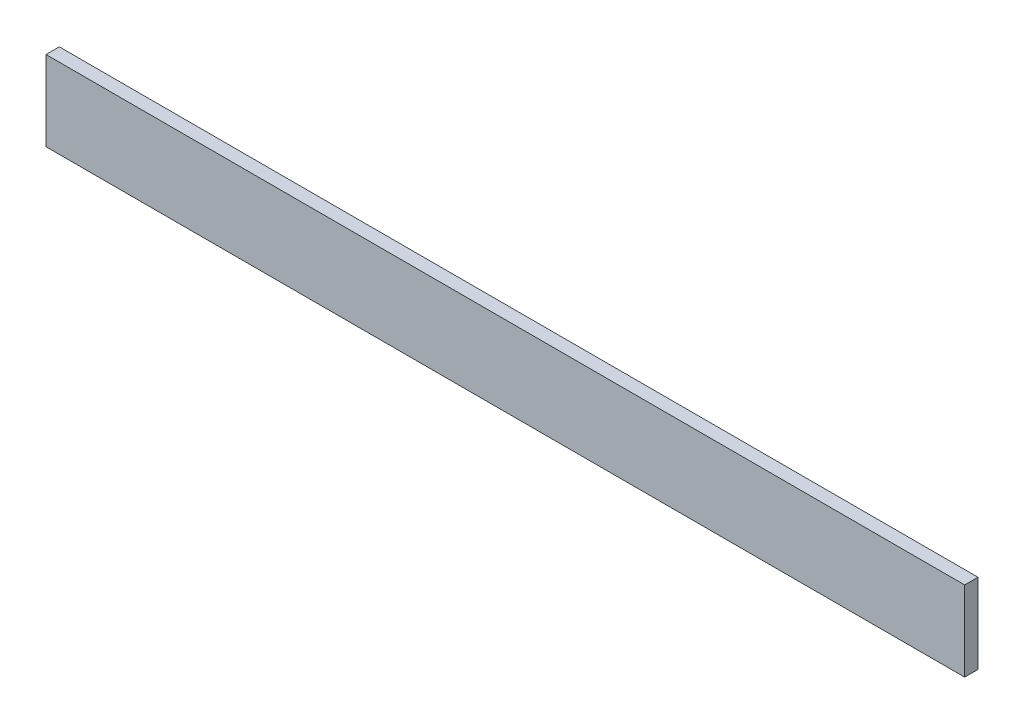
ISO-10303-21;
HEADER;
FILE_DESCRIPTION(('STEP AP214'),'2;1');
FILE_NAME('part.step','',(''),(''),'','','');
FILE_SCHEMA(('AUTOMOTIVE_DESIGN { 1 0 10303 214 1 1 1 1 }'));
ENDSEC;
DATA;
#1=APPLICATION_CONTEXT('core data for automotive mechanical design processes');
#2=APPLICATION_PROTOCOL_DEFINITION('international standard','automotive_design',2000,#1);
#3=PRODUCT_CONTEXT('',#1,'mechanical');
#4=PRODUCT('Part','Part','',(#3));
#5=PRODUCT_RELATED_PRODUCT_CATEGORY('part','',(#4));
#6=PRODUCT_DEFINITION_FORMATION('','',#4);
#7=PRODUCT_DEFINITION_CONTEXT('part definition',#1,'design');
#8=PRODUCT_DEFINITION('design','',#6,#7);
#9=PRODUCT_DEFINITION_SHAPE('','',#8);
#10=(LENGTH_UNIT() NAMED_UNIT(*) SI_UNIT(.MILLI.,.METRE.));
#11=(NAMED_UNIT(*) PLANE_ANGLE_UNIT() SI_UNIT($,.RADIAN.));
#12=(NAMED_UNIT(*) SI_UNIT($,.STERADIAN.) SOLID_ANGLE_UNIT());
#13=UNCERTAINTY_MEASURE_WITH_UNIT(LENGTH_MEASURE(1.E-05),#10,'distance_accuracy_value','');
#14=(GEOMETRIC_REPRESENTATION_CONTEXT(3) GLOBAL_UNCERTAINTY_ASSIGNED_CONTEXT((#13)) GLOBAL_UNIT_ASSIGNED_CONTEXT((#10,
#11,#12)) REPRESENTATION_CONTEXT('',''));
#15=CARTESIAN_POINT('',(0.,0.,0.));
#16=DIRECTION('',(0.,0.,1.));
#17=DIRECTION('',(1.,0.,0.));
#18=AXIS2_PLACEMENT_3D('',#15,#16,#17);
#19=CARTESIAN_POINT('',(3505.2,0.,0.));
#20=DIRECTION('',(0.,0.,-1.));
#21=DIRECTION('',(-1.,0.,0.));
#22=AXIS2_PLACEMENT_3D('',#19,#20,#21);
#23=PLANE('',#22);
#24=DIRECTION('',(0.,-1.,0.));
#25=VECTOR('',#24,1.);
#26=CARTESIAN_POINT('',(0.,0.,0.));
#27=LINE('',#26,#25);
#28=CARTESIAN_POINT('',(0.,304.8,0.));
#29=VERTEX_POINT('',#28);
#30=CARTESIAN_POINT('',(0.,0.,0.));
#31=VERTEX_POINT('',#30);
#32=EDGE_CURVE('E95',#29,#31,#27,.T.);
#33=ORIENTED_EDGE('',*,*,#32,.T.);
#34=DIRECTION('',(-1.,0.,0.));
#35=VECTOR('',#34,1.);
#36=CARTESIAN_POINT('',(3505.2,0.,0.));
#37=LINE('',#36,#35);
#38=CARTESIAN_POINT('',(3505.2,0.,0.));
#39=VERTEX_POINT('',#38);
#40=EDGE_CURVE('E11',#39,#31,#37,.T.);
#41=ORIENTED_EDGE('',*,*,#40,.F.);
#42=DIRECTION('',(0.,-1.,0.));
#43=VECTOR('',#42,1.);
#44=CARTESIAN_POINT('',(3505.2,0.,0.));
#45=LINE('',#44,#43);
#46=CARTESIAN_POINT('',(3505.2,304.8,0.));
#47=VERTEX_POINT('',#46);
#48=EDGE_CURVE('E83',#47,#39,#45,.T.);
#49=ORIENTED_EDGE('',*,*,#48,.F.);
#50=DIRECTION('',(-1.,0.,0.));
#51=VECTOR('',#50,1.);
#52=CARTESIAN_POINT('',(3505.2,304.8,0.));
#53=LINE('',#52,#51);
#54=EDGE_CURVE('E91',#47,#29,#53,.T.);
#55=ORIENTED_EDGE('',*,*,#54,.T.);
#56=EDGE_LOOP('',(#33,#41,#49,#55));
#57=FACE_BOUND('',#56,.T.);
#58=ADVANCED_FACE('F32',(#57),#23,.F.);
#59=CARTESIAN_POINT('',(3505.2,0.,0.));
#60=DIRECTION('',(0.,1.,0.));
#61=DIRECTION('',(0.,0.,1.));
#62=AXIS2_PLACEMENT_3D('',#59,#60,#61);
#63=PLANE('',#62);
#64=DIRECTION('',(0.,0.,-1.));
#65=VECTOR('',#64,1.);
#66=CARTESIAN_POINT('',(0.,0.,0.));
#67=LINE('',#66,#65);
#68=CARTESIAN_POINT('',(0.,0.,-50.8));
#69=VERTEX_POINT('',#68);
#70=EDGE_CURVE('E87',#31,#69,#67,.T.);
#71=ORIENTED_EDGE('',*,*,#70,.T.);
#72=DIRECTION('',(-1.,0.,0.));
#73=VECTOR('',#72,1.);
#74=CARTESIAN_POINT('',(3505.2,0.,-50.8));
#75=LINE('',#74,#73);
#76=CARTESIAN_POINT('',(3505.2,0.,-50.8));
#77=VERTEX_POINT('',#76);
#78=EDGE_CURVE('E40',#77,#69,#75,.T.);
#79=ORIENTED_EDGE('',*,*,#78,.F.);
#80=DIRECTION('',(0.,0.,-1.));
#81=VECTOR('',#80,1.);
#82=CARTESIAN_POINT('',(3505.2,0.,0.));
#83=LINE('',#82,#81);
#84=EDGE_CURVE('E78',#39,#77,#83,.T.);
#85=ORIENTED_EDGE('',*,*,#84,.F.);
#86=ORIENTED_EDGE('',*,*,#40,.T.);
#87=EDGE_LOOP('',(#71,#79,#85,#86));
#88=FACE_BOUND('',#87,.T.);
#89=ADVANCED_FACE('F86',(#88),#63,.F.);
#90=CARTESIAN_POINT('',(3505.2,0.,-50.8));
#91=DIRECTION('',(0.,0.,1.));
#92=DIRECTION('',(1.,0.,0.));
#93=AXIS2_PLACEMENT_3D('',#90,#91,#92);
#94=PLANE('',#93);
#95=DIRECTION('',(0.,1.,0.));
#96=VECTOR('',#95,1.);
#97=CARTESIAN_POINT('',(0.,0.,-50.8));
#98=LINE('',#97,#96);
#99=CARTESIAN_POINT('',(0.,304.8,-50.8));
#100=VERTEX_POINT('',#99);
#101=EDGE_CURVE('E65',#69,#100,#98,.T.);
#102=ORIENTED_EDGE('',*,*,#101,.T.);
#103=DIRECTION('',(-1.,0.,0.));
#104=VECTOR('',#103,1.);
#105=CARTESIAN_POINT('',(3505.2,304.8,-50.8));
#106=LINE('',#105,#104);
#107=CARTESIAN_POINT('',(3505.2,304.8,-50.8));
#108=VERTEX_POINT('',#107);
#109=EDGE_CURVE('E88',#108,#100,#106,.T.);
#110=ORIENTED_EDGE('',*,*,#109,.F.);
#111=DIRECTION('',(0.,1.,0.));
#112=VECTOR('',#111,1.);
#113=CARTESIAN_POINT('',(3505.2,0.,-50.8));
#114=LINE('',#113,#112);
#115=EDGE_CURVE('E81',#77,#108,#114,.T.);
#116=ORIENTED_EDGE('',*,*,#115,.F.);
#117=ORIENTED_EDGE('',*,*,#78,.T.);
#118=EDGE_LOOP('',(#102,#110,#116,#117));
#119=FACE_BOUND('',#118,.T.);
#120=ADVANCED_FACE('F89',(#119),#94,.F.);
#121=CARTESIAN_POINT('',(3505.2,304.8,0.));
#122=DIRECTION('',(0.,-1.,0.));
#123=DIRECTION('',(0.,0.,-1.));
#124=AXIS2_PLACEMENT_3D('',#121,#122,#123);
#125=PLANE('',#124);
#126=DIRECTION('',(0.,0.,1.));
#127=VECTOR('',#126,1.);
#128=CARTESIAN_POINT('',(0.,304.8,0.));
#129=LINE('',#128,#127);
#130=EDGE_CURVE('E71',#100,#29,#129,.T.);
#131=ORIENTED_EDGE('',*,*,#130,.T.);
#132=ORIENTED_EDGE('',*,*,#54,.F.);
#133=DIRECTION('',(0.,0.,1.));
#134=VECTOR('',#133,1.);
#135=CARTESIAN_POINT('',(3505.2,304.8,0.));
#136=LINE('',#135,#134);
#137=EDGE_CURVE('E48',#108,#47,#136,.T.);
#138=ORIENTED_EDGE('',*,*,#137,.F.);
#139=ORIENTED_EDGE('',*,*,#109,.T.);
#140=EDGE_LOOP('',(#131,#132,#138,#139));
#141=FACE_BOUND('',#140,.T.);
#142=ADVANCED_FACE('F102',(#141),#125,.F.);
#143=CARTESIAN_POINT('',(3505.2,0.,0.));
#144=DIRECTION('',(-1.,0.,0.));
#145=DIRECTION('',(0.,0.,1.));
#146=AXIS2_PLACEMENT_3D('',#143,#144,#145);
#147=PLANE('',#146);
#148=ORIENTED_EDGE('',*,*,#48,.T.);
#149=ORIENTED_EDGE('',*,*,#84,.T.);
#150=ORIENTED_EDGE('',*,*,#115,.T.);
#151=ORIENTED_EDGE('',*,*,#137,.T.);
#152=EDGE_LOOP('',(#148,#149,#150,#151));
#153=FACE_BOUND('',#152,.T.);
#154=ADVANCED_FACE('F79',(#153),#147,.F.);
#155=CARTESIAN_POINT('',(0.,0.,0.));
#156=DIRECTION('',(-1.,0.,0.));
#157=DIRECTION('',(0.,0.,1.));
#158=AXIS2_PLACEMENT_3D('',#155,#156,#157);
#159=PLANE('',#158);
#160=ORIENTED_EDGE('',*,*,#32,.F.);
#161=ORIENTED_EDGE('',*,*,#130,.F.);
#162=ORIENTED_EDGE('',*,*,#101,.F.);
#163=ORIENTED_EDGE('',*,*,#70,.F.);
#164=EDGE_LOOP('',(#160,#161,#162,#163));
#165=FACE_BOUND('',#164,.T.);
#166=ADVANCED_FACE('F105',(#165),#159,.T.);
#167=CLOSED_SHELL('',(#58,#89,#120,#142,#154,#166));
#168=MANIFOLD_SOLID_BREP('B2',#167);
#169=ADVANCED_BREP_SHAPE_REPRESENTATION('',(#18,#168),#14);
#170=SHAPE_DEFINITION_REPRESENTATION(#9,#169);
ENDSEC;
END-ISO-10303-21;
